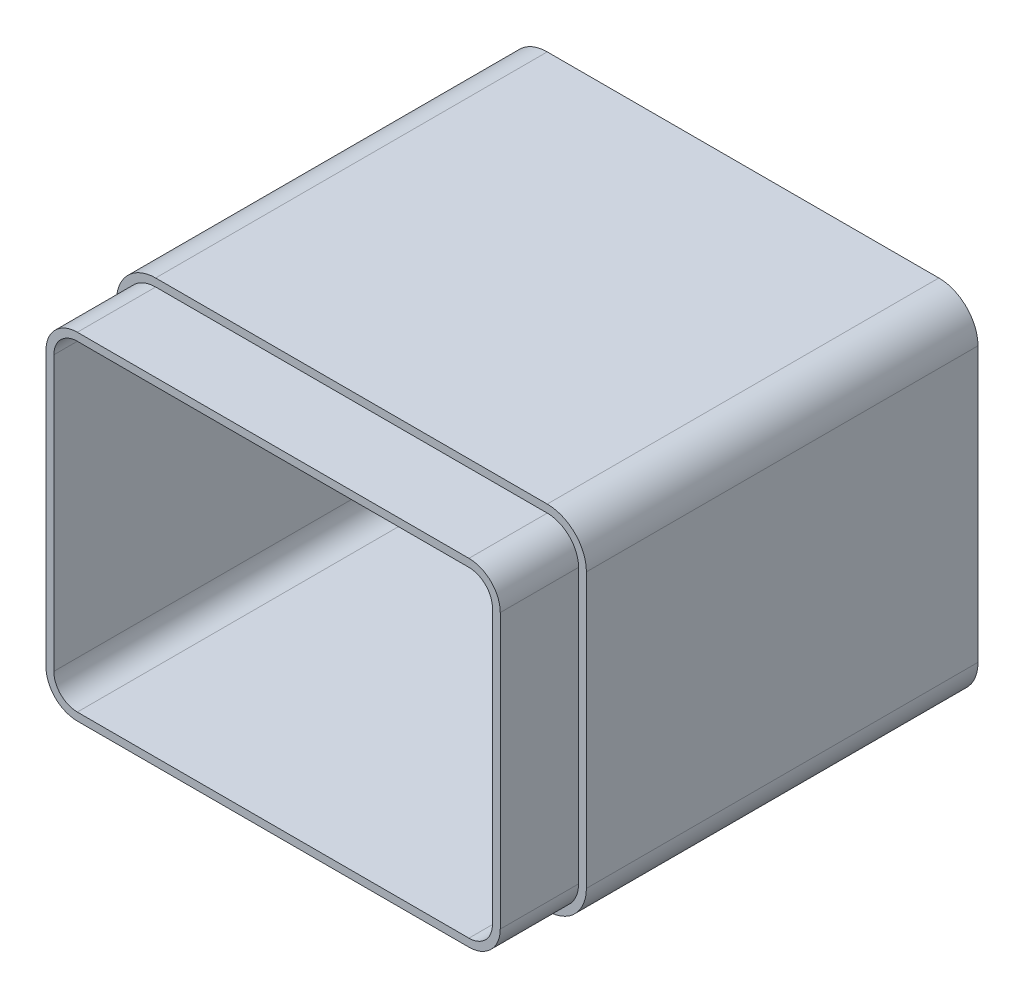
ISO-10303-21;
HEADER;
FILE_DESCRIPTION(('STEP AP214'),'2;1');
FILE_NAME('part.step','',(''),(''),'','','');
FILE_SCHEMA(('AUTOMOTIVE_DESIGN { 1 0 10303 214 1 1 1 1 }'));
ENDSEC;
DATA;
#1=APPLICATION_CONTEXT('core data for automotive mechanical design processes');
#2=APPLICATION_PROTOCOL_DEFINITION('international standard','automotive_design',2000,#1);
#3=PRODUCT_CONTEXT('',#1,'mechanical');
#4=PRODUCT('Part','Part','',(#3));
#5=PRODUCT_RELATED_PRODUCT_CATEGORY('part','',(#4));
#6=PRODUCT_DEFINITION_FORMATION('','',#4);
#7=PRODUCT_DEFINITION_CONTEXT('part definition',#1,'design');
#8=PRODUCT_DEFINITION('design','',#6,#7);
#9=PRODUCT_DEFINITION_SHAPE('','',#8);
#10=(LENGTH_UNIT() NAMED_UNIT(*) SI_UNIT(.MILLI.,.METRE.));
#11=(NAMED_UNIT(*) PLANE_ANGLE_UNIT() SI_UNIT($,.RADIAN.));
#12=(NAMED_UNIT(*) SI_UNIT($,.STERADIAN.) SOLID_ANGLE_UNIT());
#13=UNCERTAINTY_MEASURE_WITH_UNIT(LENGTH_MEASURE(1.E-05),#10,'distance_accuracy_value','');
#14=(GEOMETRIC_REPRESENTATION_CONTEXT(3) GLOBAL_UNCERTAINTY_ASSIGNED_CONTEXT((#13)) GLOBAL_UNIT_ASSIGNED_CONTEXT((#10,
#11,#12)) REPRESENTATION_CONTEXT('',''));
#15=CARTESIAN_POINT('',(0.,0.,0.));
#16=DIRECTION('',(0.,0.,1.));
#17=DIRECTION('',(1.,0.,0.));
#18=AXIS2_PLACEMENT_3D('',#15,#16,#17);
#19=CARTESIAN_POINT('',(0.,2286.,0.));
#20=DIRECTION('',(0.,0.,-1.));
#21=DIRECTION('',(-1.,0.,0.));
#22=AXIS2_PLACEMENT_3D('',#19,#20,#21);
#23=PLANE('',#22);
#24=CARTESIAN_POINT('',(2794.,2032.,0.));
#25=DIRECTION('',(0.,0.,-1.));
#26=DIRECTION('',(-1.,0.,0.));
#27=AXIS2_PLACEMENT_3D('',#24,#25,#26);
#28=CIRCLE('',#27,152.4);
#29=CARTESIAN_POINT('',(2946.4,2032.,0.));
#30=VERTEX_POINT('',#29);
#31=CARTESIAN_POINT('',(2794.,2184.4,0.));
#32=VERTEX_POINT('',#31);
#33=EDGE_CURVE('E380',#30,#32,#28,.F.);
#34=ORIENTED_EDGE('',*,*,#33,.F.);
#35=DIRECTION('',(0.,-1.,0.));
#36=VECTOR('',#35,1.);
#37=CARTESIAN_POINT('',(2946.4,2286.,0.));
#38=LINE('',#37,#36);
#39=CARTESIAN_POINT('',(2946.4,254.,0.));
#40=VERTEX_POINT('',#39);
#41=EDGE_CURVE('E346',#30,#40,#38,.T.);
#42=ORIENTED_EDGE('',*,*,#41,.T.);
#43=CARTESIAN_POINT('',(2794.,254.,0.));
#44=DIRECTION('',(0.,0.,-1.));
#45=DIRECTION('',(-1.,0.,0.));
#46=AXIS2_PLACEMENT_3D('',#43,#44,#45);
#47=CIRCLE('',#46,152.4);
#48=CARTESIAN_POINT('',(2794.,101.6,0.));
#49=VERTEX_POINT('',#48);
#50=EDGE_CURVE('E389',#49,#40,#47,.F.);
#51=ORIENTED_EDGE('',*,*,#50,.F.);
#52=DIRECTION('',(1.,0.,0.));
#53=VECTOR('',#52,1.);
#54=CARTESIAN_POINT('',(0.,101.6,0.));
#55=LINE('',#54,#53);
#56=CARTESIAN_POINT('',(254.,101.6,0.));
#57=VERTEX_POINT('',#56);
#58=EDGE_CURVE('E319',#57,#49,#55,.T.);
#59=ORIENTED_EDGE('',*,*,#58,.F.);
#60=CARTESIAN_POINT('',(254.,254.,0.));
#61=DIRECTION('',(0.,0.,-1.));
#62=DIRECTION('',(-1.,0.,0.));
#63=AXIS2_PLACEMENT_3D('',#60,#61,#62);
#64=CIRCLE('',#63,152.4);
#65=CARTESIAN_POINT('',(101.6,254.,0.));
#66=VERTEX_POINT('',#65);
#67=EDGE_CURVE('E363',#66,#57,#64,.F.);
#68=ORIENTED_EDGE('',*,*,#67,.F.);
#69=DIRECTION('',(0.,-1.,0.));
#70=VECTOR('',#69,1.);
#71=CARTESIAN_POINT('',(101.6,2286.,0.));
#72=LINE('',#71,#70);
#73=CARTESIAN_POINT('',(101.6,2032.,0.));
#74=VERTEX_POINT('',#73);
#75=EDGE_CURVE('E373',#74,#66,#72,.T.);
#76=ORIENTED_EDGE('',*,*,#75,.F.);
#77=CARTESIAN_POINT('',(254.,2032.,0.));
#78=DIRECTION('',(0.,0.,-1.));
#79=DIRECTION('',(-1.,0.,0.));
#80=AXIS2_PLACEMENT_3D('',#77,#78,#79);
#81=CIRCLE('',#80,152.4);
#82=CARTESIAN_POINT('',(254.,2184.4,0.));
#83=VERTEX_POINT('',#82);
#84=EDGE_CURVE('E386',#83,#74,#81,.F.);
#85=ORIENTED_EDGE('',*,*,#84,.F.);
#86=DIRECTION('',(1.,0.,0.));
#87=VECTOR('',#86,1.);
#88=CARTESIAN_POINT('',(0.,2184.4,0.));
#89=LINE('',#88,#87);
#90=EDGE_CURVE('E337',#83,#32,#89,.T.);
#91=ORIENTED_EDGE('',*,*,#90,.T.);
#92=EDGE_LOOP('',(#34,#42,#51,#59,#68,#76,#85,#91));
#93=FACE_BOUND('',#92,.T.);
#94=CARTESIAN_POINT('',(2794.,254.,0.));
#95=DIRECTION('',(0.,0.,1.));
#96=DIRECTION('',(1.,0.,0.));
#97=AXIS2_PLACEMENT_3D('',#94,#95,#96);
#98=CIRCLE('',#97,203.2);
#99=CARTESIAN_POINT('',(2794.,50.8,0.));
#100=VERTEX_POINT('',#99);
#101=CARTESIAN_POINT('',(2997.2,254.,0.));
#102=VERTEX_POINT('',#101);
#103=EDGE_CURVE('E255',#100,#102,#98,.T.);
#104=ORIENTED_EDGE('',*,*,#103,.T.);
#105=DIRECTION('',(0.,1.,0.));
#106=VECTOR('',#105,1.);
#107=CARTESIAN_POINT('',(2997.2,254.,0.));
#108=LINE('',#107,#106);
#109=CARTESIAN_POINT('',(2997.2,2032.,0.));
#110=VERTEX_POINT('',#109);
#111=EDGE_CURVE('E205',#102,#110,#108,.T.);
#112=ORIENTED_EDGE('',*,*,#111,.T.);
#113=CARTESIAN_POINT('',(2794.,2032.,0.));
#114=DIRECTION('',(0.,0.,1.));
#115=DIRECTION('',(1.,0.,0.));
#116=AXIS2_PLACEMENT_3D('',#113,#114,#115);
#117=CIRCLE('',#116,203.2);
#118=CARTESIAN_POINT('',(2794.,2235.2,0.));
#119=VERTEX_POINT('',#118);
#120=EDGE_CURVE('E54',#110,#119,#117,.T.);
#121=ORIENTED_EDGE('',*,*,#120,.T.);
#122=DIRECTION('',(-1.,0.,0.));
#123=VECTOR('',#122,1.);
#124=CARTESIAN_POINT('',(2794.,2235.2,0.));
#125=LINE('',#124,#123);
#126=CARTESIAN_POINT('',(254.,2235.2,0.));
#127=VERTEX_POINT('',#126);
#128=EDGE_CURVE('E262',#119,#127,#125,.T.);
#129=ORIENTED_EDGE('',*,*,#128,.T.);
#130=CARTESIAN_POINT('',(254.,2032.,0.));
#131=DIRECTION('',(0.,0.,1.));
#132=DIRECTION('',(1.,0.,0.));
#133=AXIS2_PLACEMENT_3D('',#130,#131,#132);
#134=CIRCLE('',#133,203.2);
#135=CARTESIAN_POINT('',(50.8000000000001,2032.,0.));
#136=VERTEX_POINT('',#135);
#137=EDGE_CURVE('E266',#127,#136,#134,.T.);
#138=ORIENTED_EDGE('',*,*,#137,.T.);
#139=DIRECTION('',(0.,-1.,0.));
#140=VECTOR('',#139,1.);
#141=CARTESIAN_POINT('',(50.8,2032.,0.));
#142=LINE('',#141,#140);
#143=CARTESIAN_POINT('',(50.8,254.,0.));
#144=VERTEX_POINT('',#143);
#145=EDGE_CURVE('E270',#136,#144,#142,.T.);
#146=ORIENTED_EDGE('',*,*,#145,.T.);
#147=CARTESIAN_POINT('',(254.,254.,0.));
#148=DIRECTION('',(0.,0.,1.));
#149=DIRECTION('',(1.,0.,0.));
#150=AXIS2_PLACEMENT_3D('',#147,#148,#149);
#151=CIRCLE('',#150,203.2);
#152=CARTESIAN_POINT('',(254.,50.8,0.));
#153=VERTEX_POINT('',#152);
#154=EDGE_CURVE('E232',#144,#153,#151,.T.);
#155=ORIENTED_EDGE('',*,*,#154,.T.);
#156=DIRECTION('',(1.,0.,0.));
#157=VECTOR('',#156,1.);
#158=CARTESIAN_POINT('',(254.,50.8,0.));
#159=LINE('',#158,#157);
#160=EDGE_CURVE('E228',#153,#100,#159,.T.);
#161=ORIENTED_EDGE('',*,*,#160,.T.);
#162=EDGE_LOOP('',(#104,#112,#121,#129,#138,#146,#155,#161));
#163=FACE_BOUND('',#162,.T.);
#164=ADVANCED_FACE('F38',(#93,#163),#23,.F.);
#165=CARTESIAN_POINT('',(101.6,2286.,0.));
#166=DIRECTION('',(1.,0.,0.));
#167=DIRECTION('',(0.,0.,-1.));
#168=AXIS2_PLACEMENT_3D('',#165,#166,#167);
#169=PLANE('',#168);
#170=ORIENTED_EDGE('',*,*,#75,.T.);
#171=DIRECTION('',(0.,0.,-1.));
#172=VECTOR('',#171,1.);
#173=CARTESIAN_POINT('',(101.6,254.,0.));
#174=LINE('',#173,#172);
#175=CARTESIAN_POINT('',(101.6,254.,-2946.4));
#176=VERTEX_POINT('',#175);
#177=EDGE_CURVE('E324',#176,#66,#174,.F.);
#178=ORIENTED_EDGE('',*,*,#177,.F.);
#179=DIRECTION('',(0.,-1.,0.));
#180=VECTOR('',#179,1.);
#181=CARTESIAN_POINT('',(101.6,2286.,-2946.4));
#182=LINE('',#181,#180);
#183=CARTESIAN_POINT('',(101.6,2032.,-2946.4));
#184=VERTEX_POINT('',#183);
#185=EDGE_CURVE('E325',#184,#176,#182,.T.);
#186=ORIENTED_EDGE('',*,*,#185,.F.);
#187=DIRECTION('',(0.,0.,-1.));
#188=VECTOR('',#187,1.);
#189=CARTESIAN_POINT('',(101.6,2032.,0.));
#190=LINE('',#189,#188);
#191=EDGE_CURVE('E320',#74,#184,#190,.T.);
#192=ORIENTED_EDGE('',*,*,#191,.F.);
#193=EDGE_LOOP('',(#170,#178,#186,#192));
#194=FACE_BOUND('',#193,.T.);
#195=ADVANCED_FACE('F501',(#194),#169,.T.);
#196=CARTESIAN_POINT('',(2946.4,2286.,0.));
#197=DIRECTION('',(-1.,0.,0.));
#198=DIRECTION('',(0.,0.,1.));
#199=AXIS2_PLACEMENT_3D('',#196,#197,#198);
#200=PLANE('',#199);
#201=DIRECTION('',(0.,-1.,0.));
#202=VECTOR('',#201,1.);
#203=CARTESIAN_POINT('',(2946.4,2286.,-2946.4));
#204=LINE('',#203,#202);
#205=CARTESIAN_POINT('',(2946.4,2032.,-2946.4));
#206=VERTEX_POINT('',#205);
#207=CARTESIAN_POINT('',(2946.4,254.,-2946.4));
#208=VERTEX_POINT('',#207);
#209=EDGE_CURVE('E329',#206,#208,#204,.T.);
#210=ORIENTED_EDGE('',*,*,#209,.T.);
#211=DIRECTION('',(0.,0.,1.));
#212=VECTOR('',#211,1.);
#213=CARTESIAN_POINT('',(2946.4,254.,0.));
#214=LINE('',#213,#212);
#215=EDGE_CURVE('E341',#40,#208,#214,.F.);
#216=ORIENTED_EDGE('',*,*,#215,.F.);
#217=ORIENTED_EDGE('',*,*,#41,.F.);
#218=DIRECTION('',(0.,0.,1.));
#219=VECTOR('',#218,1.);
#220=CARTESIAN_POINT('',(2946.4,2032.,0.));
#221=LINE('',#220,#219);
#222=EDGE_CURVE('E360',#206,#30,#221,.T.);
#223=ORIENTED_EDGE('',*,*,#222,.F.);
#224=EDGE_LOOP('',(#210,#216,#217,#223));
#225=FACE_BOUND('',#224,.T.);
#226=ADVANCED_FACE('F507',(#225),#200,.T.);
#227=CARTESIAN_POINT('',(0.,2286.,-2946.4));
#228=DIRECTION('',(0.,0.,1.));
#229=DIRECTION('',(1.,0.,0.));
#230=AXIS2_PLACEMENT_3D('',#227,#228,#229);
#231=PLANE('',#230);
#232=DIRECTION('',(-1.,0.,0.));
#233=VECTOR('',#232,1.);
#234=CARTESIAN_POINT('',(0.,2184.4,-2946.4));
#235=LINE('',#234,#233);
#236=CARTESIAN_POINT('',(2794.,2184.4,-2946.4));
#237=VERTEX_POINT('',#236);
#238=CARTESIAN_POINT('',(254.,2184.4,-2946.4));
#239=VERTEX_POINT('',#238);
#240=EDGE_CURVE('E330',#237,#239,#235,.T.);
#241=ORIENTED_EDGE('',*,*,#240,.T.);
#242=CARTESIAN_POINT('',(254.,2032.,-2946.4));
#243=DIRECTION('',(0.,0.,1.));
#244=DIRECTION('',(1.,0.,0.));
#245=AXIS2_PLACEMENT_3D('',#242,#243,#244);
#246=CIRCLE('',#245,152.4);
#247=EDGE_CURVE('E349',#184,#239,#246,.F.);
#248=ORIENTED_EDGE('',*,*,#247,.F.);
#249=ORIENTED_EDGE('',*,*,#185,.T.);
#250=CARTESIAN_POINT('',(254.,254.,-2946.4));
#251=DIRECTION('',(0.,0.,1.));
#252=DIRECTION('',(1.,0.,0.));
#253=AXIS2_PLACEMENT_3D('',#250,#251,#252);
#254=CIRCLE('',#253,152.4);
#255=CARTESIAN_POINT('',(254.,101.6,-2946.4));
#256=VERTEX_POINT('',#255);
#257=EDGE_CURVE('E354',#256,#176,#254,.F.);
#258=ORIENTED_EDGE('',*,*,#257,.F.);
#259=DIRECTION('',(-1.,0.,0.));
#260=VECTOR('',#259,1.);
#261=CARTESIAN_POINT('',(0.,101.6,-2946.4));
#262=LINE('',#261,#260);
#263=CARTESIAN_POINT('',(2794.,101.6,-2946.4));
#264=VERTEX_POINT('',#263);
#265=EDGE_CURVE('E350',#264,#256,#262,.T.);
#266=ORIENTED_EDGE('',*,*,#265,.F.);
#267=CARTESIAN_POINT('',(2794.,254.,-2946.4));
#268=DIRECTION('',(0.,0.,1.));
#269=DIRECTION('',(1.,0.,0.));
#270=AXIS2_PLACEMENT_3D('',#267,#268,#269);
#271=CIRCLE('',#270,152.4);
#272=EDGE_CURVE('E342',#208,#264,#271,.F.);
#273=ORIENTED_EDGE('',*,*,#272,.F.);
#274=ORIENTED_EDGE('',*,*,#209,.F.);
#275=CARTESIAN_POINT('',(2794.,2032.,-2946.4));
#276=DIRECTION('',(0.,0.,1.));
#277=DIRECTION('',(1.,0.,0.));
#278=AXIS2_PLACEMENT_3D('',#275,#276,#277);
#279=CIRCLE('',#278,152.4);
#280=EDGE_CURVE('E338',#237,#206,#279,.F.);
#281=ORIENTED_EDGE('',*,*,#280,.F.);
#282=EDGE_LOOP('',(#241,#248,#249,#258,#266,#273,#274,#281));
#283=FACE_BOUND('',#282,.T.);
#284=ADVANCED_FACE('F552',(#283),#231,.T.);
#285=CARTESIAN_POINT('',(0.,2184.4,0.));
#286=DIRECTION('',(0.,-1.,0.));
#287=DIRECTION('',(0.,0.,-1.));
#288=AXIS2_PLACEMENT_3D('',#285,#286,#287);
#289=PLANE('',#288);
#290=ORIENTED_EDGE('',*,*,#90,.F.);
#291=DIRECTION('',(0.,0.,-1.));
#292=VECTOR('',#291,1.);
#293=CARTESIAN_POINT('',(254.,2184.4,0.));
#294=LINE('',#293,#292);
#295=EDGE_CURVE('E370',#239,#83,#294,.F.);
#296=ORIENTED_EDGE('',*,*,#295,.F.);
#297=ORIENTED_EDGE('',*,*,#240,.F.);
#298=DIRECTION('',(0.,0.,-1.));
#299=VECTOR('',#298,1.);
#300=CARTESIAN_POINT('',(2794.,2184.4,0.));
#301=LINE('',#300,#299);
#302=EDGE_CURVE('E357',#32,#237,#301,.T.);
#303=ORIENTED_EDGE('',*,*,#302,.F.);
#304=EDGE_LOOP('',(#290,#296,#297,#303));
#305=FACE_BOUND('',#304,.T.);
#306=ADVANCED_FACE('F548',(#305),#289,.T.);
#307=CARTESIAN_POINT('',(0.,101.6,0.));
#308=DIRECTION('',(0.,-1.,0.));
#309=DIRECTION('',(0.,0.,-1.));
#310=AXIS2_PLACEMENT_3D('',#307,#308,#309);
#311=PLANE('',#310);
#312=ORIENTED_EDGE('',*,*,#265,.T.);
#313=DIRECTION('',(0.,0.,-1.));
#314=VECTOR('',#313,1.);
#315=CARTESIAN_POINT('',(254.,101.6,0.));
#316=LINE('',#315,#314);
#317=EDGE_CURVE('E377',#57,#256,#316,.T.);
#318=ORIENTED_EDGE('',*,*,#317,.F.);
#319=ORIENTED_EDGE('',*,*,#58,.T.);
#320=DIRECTION('',(0.,0.,-1.));
#321=VECTOR('',#320,1.);
#322=CARTESIAN_POINT('',(2794.,101.6,0.));
#323=LINE('',#322,#321);
#324=EDGE_CURVE('E333',#264,#49,#323,.F.);
#325=ORIENTED_EDGE('',*,*,#324,.F.);
#326=EDGE_LOOP('',(#312,#318,#319,#325));
#327=FACE_BOUND('',#326,.T.);
#328=ADVANCED_FACE('F544',(#327),#311,.F.);
#329=CARTESIAN_POINT('',(2794.,2032.,0.));
#330=DIRECTION('',(0.,0.,-1.));
#331=DIRECTION('',(-1.,0.,0.));
#332=AXIS2_PLACEMENT_3D('',#329,#330,#331);
#333=CYLINDRICAL_SURFACE('',#332,152.4);
#334=ORIENTED_EDGE('',*,*,#33,.T.);
#335=ORIENTED_EDGE('',*,*,#302,.T.);
#336=ORIENTED_EDGE('',*,*,#280,.T.);
#337=ORIENTED_EDGE('',*,*,#222,.T.);
#338=EDGE_LOOP('',(#334,#335,#336,#337));
#339=FACE_BOUND('',#338,.T.);
#340=ADVANCED_FACE('F540',(#339),#333,.F.);
#341=CARTESIAN_POINT('',(2794.,254.,0.));
#342=DIRECTION('',(0.,0.,1.));
#343=DIRECTION('',(1.,0.,0.));
#344=AXIS2_PLACEMENT_3D('',#341,#342,#343);
#345=CYLINDRICAL_SURFACE('',#344,152.4);
#346=ORIENTED_EDGE('',*,*,#50,.T.);
#347=ORIENTED_EDGE('',*,*,#215,.T.);
#348=ORIENTED_EDGE('',*,*,#272,.T.);
#349=ORIENTED_EDGE('',*,*,#324,.T.);
#350=EDGE_LOOP('',(#346,#347,#348,#349));
#351=FACE_BOUND('',#350,.T.);
#352=ADVANCED_FACE('F536',(#351),#345,.F.);
#353=CARTESIAN_POINT('',(254.,2032.,0.));
#354=DIRECTION('',(0.,0.,1.));
#355=DIRECTION('',(1.,0.,0.));
#356=AXIS2_PLACEMENT_3D('',#353,#354,#355);
#357=CYLINDRICAL_SURFACE('',#356,152.4);
#358=ORIENTED_EDGE('',*,*,#247,.T.);
#359=ORIENTED_EDGE('',*,*,#295,.T.);
#360=ORIENTED_EDGE('',*,*,#84,.T.);
#361=ORIENTED_EDGE('',*,*,#191,.T.);
#362=EDGE_LOOP('',(#358,#359,#360,#361));
#363=FACE_BOUND('',#362,.T.);
#364=ADVANCED_FACE('F532',(#363),#357,.F.);
#365=CARTESIAN_POINT('',(254.,254.,0.));
#366=DIRECTION('',(0.,0.,-1.));
#367=DIRECTION('',(-1.,0.,0.));
#368=AXIS2_PLACEMENT_3D('',#365,#366,#367);
#369=CYLINDRICAL_SURFACE('',#368,152.4);
#370=ORIENTED_EDGE('',*,*,#257,.T.);
#371=ORIENTED_EDGE('',*,*,#177,.T.);
#372=ORIENTED_EDGE('',*,*,#67,.T.);
#373=ORIENTED_EDGE('',*,*,#317,.T.);
#374=EDGE_LOOP('',(#370,#371,#372,#373));
#375=FACE_BOUND('',#374,.T.);
#376=ADVANCED_FACE('F529',(#375),#369,.F.);
#377=CARTESIAN_POINT('',(2794.,254.,-508.));
#378=DIRECTION('',(0.,0.,1.));
#379=DIRECTION('',(1.,0.,0.));
#380=AXIS2_PLACEMENT_3D('',#377,#378,#379);
#381=PLANE('',#380);
#382=DIRECTION('',(1.,0.,0.));
#383=VECTOR('',#382,1.);
#384=CARTESIAN_POINT('',(254.,50.8,-508.));
#385=LINE('',#384,#383);
#386=CARTESIAN_POINT('',(254.,50.8,-508.));
#387=VERTEX_POINT('',#386);
#388=CARTESIAN_POINT('',(2794.,50.8,-508.));
#389=VERTEX_POINT('',#388);
#390=EDGE_CURVE('E212',#387,#389,#385,.T.);
#391=ORIENTED_EDGE('',*,*,#390,.F.);
#392=CARTESIAN_POINT('',(254.,254.,-508.));
#393=DIRECTION('',(0.,0.,1.));
#394=DIRECTION('',(1.,0.,0.));
#395=AXIS2_PLACEMENT_3D('',#392,#393,#394);
#396=CIRCLE('',#395,203.2);
#397=CARTESIAN_POINT('',(50.8,254.,-508.));
#398=VERTEX_POINT('',#397);
#399=EDGE_CURVE('E249',#398,#387,#396,.T.);
#400=ORIENTED_EDGE('',*,*,#399,.F.);
#401=DIRECTION('',(0.,-1.,0.));
#402=VECTOR('',#401,1.);
#403=CARTESIAN_POINT('',(50.8,2032.,-508.));
#404=LINE('',#403,#402);
#405=CARTESIAN_POINT('',(50.8000000000001,2032.,-508.));
#406=VERTEX_POINT('',#405);
#407=EDGE_CURVE('E245',#406,#398,#404,.T.);
#408=ORIENTED_EDGE('',*,*,#407,.F.);
#409=CARTESIAN_POINT('',(254.,2032.,-508.));
#410=DIRECTION('',(0.,0.,1.));
#411=DIRECTION('',(1.,0.,0.));
#412=AXIS2_PLACEMENT_3D('',#409,#410,#411);
#413=CIRCLE('',#412,203.2);
#414=CARTESIAN_POINT('',(254.,2235.2,-508.));
#415=VERTEX_POINT('',#414);
#416=EDGE_CURVE('E241',#415,#406,#413,.T.);
#417=ORIENTED_EDGE('',*,*,#416,.F.);
#418=DIRECTION('',(-1.,0.,0.));
#419=VECTOR('',#418,1.);
#420=CARTESIAN_POINT('',(2794.,2235.2,-508.));
#421=LINE('',#420,#419);
#422=CARTESIAN_POINT('',(2794.,2235.2,-508.));
#423=VERTEX_POINT('',#422);
#424=EDGE_CURVE('E237',#423,#415,#421,.T.);
#425=ORIENTED_EDGE('',*,*,#424,.F.);
#426=CARTESIAN_POINT('',(2794.,2032.,-508.));
#427=DIRECTION('',(0.,0.,1.));
#428=DIRECTION('',(1.,0.,0.));
#429=AXIS2_PLACEMENT_3D('',#426,#427,#428);
#430=CIRCLE('',#429,203.2);
#431=CARTESIAN_POINT('',(2997.2,2032.,-508.));
#432=VERTEX_POINT('',#431);
#433=EDGE_CURVE('E222',#432,#423,#430,.T.);
#434=ORIENTED_EDGE('',*,*,#433,.F.);
#435=DIRECTION('',(0.,1.,0.));
#436=VECTOR('',#435,1.);
#437=CARTESIAN_POINT('',(2997.2,254.,-508.));
#438=LINE('',#437,#436);
#439=CARTESIAN_POINT('',(2997.2,254.,-508.));
#440=VERTEX_POINT('',#439);
#441=EDGE_CURVE('E203',#440,#432,#438,.T.);
#442=ORIENTED_EDGE('',*,*,#441,.F.);
#443=CARTESIAN_POINT('',(2794.,254.,-508.));
#444=DIRECTION('',(0.,0.,1.));
#445=DIRECTION('',(1.,0.,0.));
#446=AXIS2_PLACEMENT_3D('',#443,#444,#445);
#447=CIRCLE('',#446,203.2);
#448=EDGE_CURVE('E218',#389,#440,#447,.T.);
#449=ORIENTED_EDGE('',*,*,#448,.F.);
#450=EDGE_LOOP('',(#391,#400,#408,#417,#425,#434,#442,#449));
#451=FACE_BOUND('',#450,.T.);
#452=CARTESIAN_POINT('',(2794.,254.,-508.));
#453=DIRECTION('',(0.,0.,1.));
#454=DIRECTION('',(1.,0.,0.));
#455=AXIS2_PLACEMENT_3D('',#452,#453,#454);
#456=CIRCLE('',#455,254.);
#457=CARTESIAN_POINT('',(2794.,0.,-508.));
#458=VERTEX_POINT('',#457);
#459=CARTESIAN_POINT('',(3048.,254.,-508.));
#460=VERTEX_POINT('',#459);
#461=EDGE_CURVE('E279',#458,#460,#456,.T.);
#462=ORIENTED_EDGE('',*,*,#461,.T.);
#463=DIRECTION('',(0.,1.,0.));
#464=VECTOR('',#463,1.);
#465=CARTESIAN_POINT('',(3048.,254.,-508.));
#466=LINE('',#465,#464);
#467=CARTESIAN_POINT('',(3048.,2032.,-508.));
#468=VERTEX_POINT('',#467);
#469=EDGE_CURVE('E299',#460,#468,#466,.T.);
#470=ORIENTED_EDGE('',*,*,#469,.T.);
#471=CARTESIAN_POINT('',(2794.,2032.,-508.));
#472=DIRECTION('',(0.,0.,1.));
#473=DIRECTION('',(1.,0.,0.));
#474=AXIS2_PLACEMENT_3D('',#471,#472,#473);
#475=CIRCLE('',#474,254.);
#476=CARTESIAN_POINT('',(2794.,2286.,-508.));
#477=VERTEX_POINT('',#476);
#478=EDGE_CURVE('E302',#468,#477,#475,.T.);
#479=ORIENTED_EDGE('',*,*,#478,.T.);
#480=DIRECTION('',(-1.,0.,0.));
#481=VECTOR('',#480,1.);
#482=CARTESIAN_POINT('',(2794.,2286.,-508.));
#483=LINE('',#482,#481);
#484=CARTESIAN_POINT('',(254.,2286.,-508.));
#485=VERTEX_POINT('',#484);
#486=EDGE_CURVE('E305',#477,#485,#483,.T.);
#487=ORIENTED_EDGE('',*,*,#486,.T.);
#488=CARTESIAN_POINT('',(254.,2032.,-508.));
#489=DIRECTION('',(0.,0.,1.));
#490=DIRECTION('',(1.,0.,0.));
#491=AXIS2_PLACEMENT_3D('',#488,#489,#490);
#492=CIRCLE('',#491,254.);
#493=CARTESIAN_POINT('',(0.,2032.,-508.));
#494=VERTEX_POINT('',#493);
#495=EDGE_CURVE('E308',#485,#494,#492,.T.);
#496=ORIENTED_EDGE('',*,*,#495,.T.);
#497=DIRECTION('',(0.,-1.,0.));
#498=VECTOR('',#497,1.);
#499=CARTESIAN_POINT('',(0.,2032.,-508.));
#500=LINE('',#499,#498);
#501=CARTESIAN_POINT('',(0.,254.,-508.));
#502=VERTEX_POINT('',#501);
#503=EDGE_CURVE('E62',#494,#502,#500,.T.);
#504=ORIENTED_EDGE('',*,*,#503,.T.);
#505=CARTESIAN_POINT('',(254.,254.,-508.));
#506=DIRECTION('',(0.,0.,1.));
#507=DIRECTION('',(1.,0.,0.));
#508=AXIS2_PLACEMENT_3D('',#505,#506,#507);
#509=CIRCLE('',#508,254.);
#510=CARTESIAN_POINT('',(254.,0.,-508.));
#511=VERTEX_POINT('',#510);
#512=EDGE_CURVE('E313',#502,#511,#509,.T.);
#513=ORIENTED_EDGE('',*,*,#512,.T.);
#514=DIRECTION('',(1.,0.,0.));
#515=VECTOR('',#514,1.);
#516=CARTESIAN_POINT('',(254.,0.,-508.));
#517=LINE('',#516,#515);
#518=EDGE_CURVE('E316',#511,#458,#517,.T.);
#519=ORIENTED_EDGE('',*,*,#518,.T.);
#520=EDGE_LOOP('',(#462,#470,#479,#487,#496,#504,#513,#519));
#521=FACE_BOUND('',#520,.T.);
#522=ADVANCED_FACE('F217',(#451,#521),#381,.T.);
#523=CARTESIAN_POINT('',(2794.,254.,-508.));
#524=DIRECTION('',(0.,0.,1.));
#525=DIRECTION('',(1.,0.,0.));
#526=AXIS2_PLACEMENT_3D('',#523,#524,#525);
#527=CYLINDRICAL_SURFACE('',#526,203.2);
#528=ORIENTED_EDGE('',*,*,#103,.F.);
#529=DIRECTION('',(0.,0.,1.));
#530=VECTOR('',#529,1.);
#531=CARTESIAN_POINT('',(2794.,50.8,-508.));
#532=LINE('',#531,#530);
#533=EDGE_CURVE('E226',#389,#100,#532,.T.);
#534=ORIENTED_EDGE('',*,*,#533,.F.);
#535=ORIENTED_EDGE('',*,*,#448,.T.);
#536=DIRECTION('',(0.,0.,1.));
#537=VECTOR('',#536,1.);
#538=CARTESIAN_POINT('',(2997.2,254.,-508.));
#539=LINE('',#538,#537);
#540=EDGE_CURVE('E200',#440,#102,#539,.T.);
#541=ORIENTED_EDGE('',*,*,#540,.T.);
#542=EDGE_LOOP('',(#528,#534,#535,#541));
#543=FACE_BOUND('',#542,.T.);
#544=ADVANCED_FACE('F225',(#543),#527,.T.);
#545=CARTESIAN_POINT('',(254.,50.8,-508.));
#546=DIRECTION('',(0.,-1.,0.));
#547=DIRECTION('',(1.,0.,0.));
#548=AXIS2_PLACEMENT_3D('',#545,#546,#547);
#549=PLANE('',#548);
#550=ORIENTED_EDGE('',*,*,#160,.F.);
#551=DIRECTION('',(0.,0.,1.));
#552=VECTOR('',#551,1.);
#553=CARTESIAN_POINT('',(254.,50.8,-508.));
#554=LINE('',#553,#552);
#555=EDGE_CURVE('E280',#387,#153,#554,.T.);
#556=ORIENTED_EDGE('',*,*,#555,.F.);
#557=ORIENTED_EDGE('',*,*,#390,.T.);
#558=ORIENTED_EDGE('',*,*,#533,.T.);
#559=EDGE_LOOP('',(#550,#556,#557,#558));
#560=FACE_BOUND('',#559,.T.);
#561=ADVANCED_FACE('F563',(#560),#549,.T.);
#562=CARTESIAN_POINT('',(254.,254.,-508.));
#563=DIRECTION('',(0.,0.,1.));
#564=DIRECTION('',(1.,0.,0.));
#565=AXIS2_PLACEMENT_3D('',#562,#563,#564);
#566=CYLINDRICAL_SURFACE('',#565,203.2);
#567=ORIENTED_EDGE('',*,*,#154,.F.);
#568=DIRECTION('',(0.,0.,1.));
#569=VECTOR('',#568,1.);
#570=CARTESIAN_POINT('',(50.8,254.,-508.));
#571=LINE('',#570,#569);
#572=EDGE_CURVE('E283',#398,#144,#571,.T.);
#573=ORIENTED_EDGE('',*,*,#572,.F.);
#574=ORIENTED_EDGE('',*,*,#399,.T.);
#575=ORIENTED_EDGE('',*,*,#555,.T.);
#576=EDGE_LOOP('',(#567,#573,#574,#575));
#577=FACE_BOUND('',#576,.T.);
#578=ADVANCED_FACE('F578',(#577),#566,.T.);
#579=CARTESIAN_POINT('',(50.8,2032.,-508.));
#580=DIRECTION('',(-1.,0.,0.));
#581=DIRECTION('',(0.,-1.,0.));
#582=AXIS2_PLACEMENT_3D('',#579,#580,#581);
#583=PLANE('',#582);
#584=ORIENTED_EDGE('',*,*,#145,.F.);
#585=DIRECTION('',(0.,0.,1.));
#586=VECTOR('',#585,1.);
#587=CARTESIAN_POINT('',(50.8000000000001,2032.,-508.));
#588=LINE('',#587,#586);
#589=EDGE_CURVE('E286',#406,#136,#588,.T.);
#590=ORIENTED_EDGE('',*,*,#589,.F.);
#591=ORIENTED_EDGE('',*,*,#407,.T.);
#592=ORIENTED_EDGE('',*,*,#572,.T.);
#593=EDGE_LOOP('',(#584,#590,#591,#592));
#594=FACE_BOUND('',#593,.T.);
#595=ADVANCED_FACE('F574',(#594),#583,.T.);
#596=CARTESIAN_POINT('',(254.,2032.,-508.));
#597=DIRECTION('',(0.,0.,1.));
#598=DIRECTION('',(1.,0.,0.));
#599=AXIS2_PLACEMENT_3D('',#596,#597,#598);
#600=CYLINDRICAL_SURFACE('',#599,203.2);
#601=ORIENTED_EDGE('',*,*,#137,.F.);
#602=DIRECTION('',(0.,0.,1.));
#603=VECTOR('',#602,1.);
#604=CARTESIAN_POINT('',(254.,2235.2,-508.));
#605=LINE('',#604,#603);
#606=EDGE_CURVE('E289',#415,#127,#605,.T.);
#607=ORIENTED_EDGE('',*,*,#606,.F.);
#608=ORIENTED_EDGE('',*,*,#416,.T.);
#609=ORIENTED_EDGE('',*,*,#589,.T.);
#610=EDGE_LOOP('',(#601,#607,#608,#609));
#611=FACE_BOUND('',#610,.T.);
#612=ADVANCED_FACE('F570',(#611),#600,.T.);
#613=CARTESIAN_POINT('',(2794.,2235.2,-508.));
#614=DIRECTION('',(0.,1.,0.));
#615=DIRECTION('',(0.,0.,1.));
#616=AXIS2_PLACEMENT_3D('',#613,#614,#615);
#617=PLANE('',#616);
#618=ORIENTED_EDGE('',*,*,#128,.F.);
#619=DIRECTION('',(0.,0.,1.));
#620=VECTOR('',#619,1.);
#621=CARTESIAN_POINT('',(2794.,2235.2,-508.));
#622=LINE('',#621,#620);
#623=EDGE_CURVE('E292',#423,#119,#622,.T.);
#624=ORIENTED_EDGE('',*,*,#623,.F.);
#625=ORIENTED_EDGE('',*,*,#424,.T.);
#626=ORIENTED_EDGE('',*,*,#606,.T.);
#627=EDGE_LOOP('',(#618,#624,#625,#626));
#628=FACE_BOUND('',#627,.T.);
#629=ADVANCED_FACE('F567',(#628),#617,.T.);
#630=CARTESIAN_POINT('',(2794.,2032.,-508.));
#631=DIRECTION('',(0.,0.,1.));
#632=DIRECTION('',(1.,0.,0.));
#633=AXIS2_PLACEMENT_3D('',#630,#631,#632);
#634=CYLINDRICAL_SURFACE('',#633,203.2);
#635=ORIENTED_EDGE('',*,*,#120,.F.);
#636=DIRECTION('',(0.,0.,1.));
#637=VECTOR('',#636,1.);
#638=CARTESIAN_POINT('',(2997.2,2032.,-508.));
#639=LINE('',#638,#637);
#640=EDGE_CURVE('E211',#432,#110,#639,.T.);
#641=ORIENTED_EDGE('',*,*,#640,.F.);
#642=ORIENTED_EDGE('',*,*,#433,.T.);
#643=ORIENTED_EDGE('',*,*,#623,.T.);
#644=EDGE_LOOP('',(#635,#641,#642,#643));
#645=FACE_BOUND('',#644,.T.);
#646=ADVANCED_FACE('F496',(#645),#634,.T.);
#647=CARTESIAN_POINT('',(2997.2,254.,-508.));
#648=DIRECTION('',(1.,0.,0.));
#649=DIRECTION('',(0.,0.,-1.));
#650=AXIS2_PLACEMENT_3D('',#647,#648,#649);
#651=PLANE('',#650);
#652=ORIENTED_EDGE('',*,*,#111,.F.);
#653=ORIENTED_EDGE('',*,*,#540,.F.);
#654=ORIENTED_EDGE('',*,*,#441,.T.);
#655=ORIENTED_EDGE('',*,*,#640,.T.);
#656=EDGE_LOOP('',(#652,#653,#654,#655));
#657=FACE_BOUND('',#656,.T.);
#658=ADVANCED_FACE('F202',(#657),#651,.T.);
#659=CARTESIAN_POINT('',(0.,2286.,-3048.));
#660=DIRECTION('',(0.,0.,1.));
#661=DIRECTION('',(1.,0.,0.));
#662=AXIS2_PLACEMENT_3D('',#659,#660,#661);
#663=PLANE('',#662);
#664=DIRECTION('',(-1.,0.,0.));
#665=VECTOR('',#664,1.);
#666=CARTESIAN_POINT('',(0.,2286.,-3048.));
#667=LINE('',#666,#665);
#668=CARTESIAN_POINT('',(2794.,2286.,-3048.));
#669=VERTEX_POINT('',#668);
#670=CARTESIAN_POINT('',(254.,2286.,-3048.));
#671=VERTEX_POINT('',#670);
#672=EDGE_CURVE('E402',#669,#671,#667,.T.);
#673=ORIENTED_EDGE('',*,*,#672,.F.);
#674=CARTESIAN_POINT('',(2794.,2032.,-3048.));
#675=DIRECTION('',(0.,0.,1.));
#676=DIRECTION('',(1.,0.,0.));
#677=AXIS2_PLACEMENT_3D('',#674,#675,#676);
#678=CIRCLE('',#677,254.);
#679=CARTESIAN_POINT('',(3048.,2032.,-3048.));
#680=VERTEX_POINT('',#679);
#681=EDGE_CURVE('E433',#669,#680,#678,.F.);
#682=ORIENTED_EDGE('',*,*,#681,.T.);
#683=DIRECTION('',(0.,-1.,0.));
#684=VECTOR('',#683,1.);
#685=CARTESIAN_POINT('',(3048.,2286.,-3048.));
#686=LINE('',#685,#684);
#687=CARTESIAN_POINT('',(3048.,254.,-3048.));
#688=VERTEX_POINT('',#687);
#689=EDGE_CURVE('E413',#680,#688,#686,.T.);
#690=ORIENTED_EDGE('',*,*,#689,.T.);
#691=CARTESIAN_POINT('',(2794.,254.,-3048.));
#692=DIRECTION('',(0.,0.,1.));
#693=DIRECTION('',(1.,0.,0.));
#694=AXIS2_PLACEMENT_3D('',#691,#692,#693);
#695=CIRCLE('',#694,254.);
#696=CARTESIAN_POINT('',(2794.,0.,-3048.));
#697=VERTEX_POINT('',#696);
#698=EDGE_CURVE('E430',#688,#697,#695,.F.);
#699=ORIENTED_EDGE('',*,*,#698,.T.);
#700=DIRECTION('',(-1.,0.,0.));
#701=VECTOR('',#700,1.);
#702=CARTESIAN_POINT('',(0.,0.,-3048.));
#703=LINE('',#702,#701);
#704=CARTESIAN_POINT('',(254.,0.,-3048.));
#705=VERTEX_POINT('',#704);
#706=EDGE_CURVE('E323',#697,#705,#703,.T.);
#707=ORIENTED_EDGE('',*,*,#706,.T.);
#708=CARTESIAN_POINT('',(254.,254.,-3048.));
#709=DIRECTION('',(0.,0.,1.));
#710=DIRECTION('',(1.,0.,0.));
#711=AXIS2_PLACEMENT_3D('',#708,#709,#710);
#712=CIRCLE('',#711,254.);
#713=CARTESIAN_POINT('',(0.,254.,-3048.));
#714=VERTEX_POINT('',#713);
#715=EDGE_CURVE('E424',#705,#714,#712,.F.);
#716=ORIENTED_EDGE('',*,*,#715,.T.);
#717=DIRECTION('',(0.,-1.,0.));
#718=VECTOR('',#717,1.);
#719=CARTESIAN_POINT('',(0.,2286.,-3048.));
#720=LINE('',#719,#718);
#721=CARTESIAN_POINT('',(0.,2032.,-3048.));
#722=VERTEX_POINT('',#721);
#723=EDGE_CURVE('E406',#722,#714,#720,.T.);
#724=ORIENTED_EDGE('',*,*,#723,.F.);
#725=CARTESIAN_POINT('',(254.,2032.,-3048.));
#726=DIRECTION('',(0.,0.,1.));
#727=DIRECTION('',(1.,0.,0.));
#728=AXIS2_PLACEMENT_3D('',#725,#726,#727);
#729=CIRCLE('',#728,254.);
#730=EDGE_CURVE('E427',#722,#671,#729,.F.);
#731=ORIENTED_EDGE('',*,*,#730,.T.);
#732=EDGE_LOOP('',(#673,#682,#690,#699,#707,#716,#724,#731));
#733=FACE_BOUND('',#732,.T.);
#734=ADVANCED_FACE('F489',(#733),#663,.F.);
#735=CARTESIAN_POINT('',(254.,2032.,0.));
#736=DIRECTION('',(0.,0.,1.));
#737=DIRECTION('',(1.,0.,0.));
#738=AXIS2_PLACEMENT_3D('',#735,#736,#737);
#739=CYLINDRICAL_SURFACE('',#738,254.);
#740=DIRECTION('',(0.,0.,1.));
#741=VECTOR('',#740,1.);
#742=CARTESIAN_POINT('',(0.,2032.,0.));
#743=LINE('',#742,#741);
#744=EDGE_CURVE('E11',#494,#722,#743,.F.);
#745=ORIENTED_EDGE('',*,*,#744,.F.);
#746=ORIENTED_EDGE('',*,*,#495,.F.);
#747=DIRECTION('',(0.,0.,1.));
#748=VECTOR('',#747,1.);
#749=CARTESIAN_POINT('',(254.,2286.,0.));
#750=LINE('',#749,#748);
#751=EDGE_CURVE('E417',#671,#485,#750,.T.);
#752=ORIENTED_EDGE('',*,*,#751,.F.);
#753=ORIENTED_EDGE('',*,*,#730,.F.);
#754=EDGE_LOOP('',(#745,#746,#752,#753));
#755=FACE_BOUND('',#754,.T.);
#756=ADVANCED_FACE('F487',(#755),#739,.T.);
#757=CARTESIAN_POINT('',(2794.,2032.,0.));
#758=DIRECTION('',(0.,0.,-1.));
#759=DIRECTION('',(-1.,0.,0.));
#760=AXIS2_PLACEMENT_3D('',#757,#758,#759);
#761=CYLINDRICAL_SURFACE('',#760,254.);
#762=DIRECTION('',(0.,0.,-1.));
#763=VECTOR('',#762,1.);
#764=CARTESIAN_POINT('',(2794.,2286.,0.));
#765=LINE('',#764,#763);
#766=EDGE_CURVE('E421',#477,#669,#765,.T.);
#767=ORIENTED_EDGE('',*,*,#766,.F.);
#768=ORIENTED_EDGE('',*,*,#478,.F.);
#769=DIRECTION('',(0.,0.,-1.));
#770=VECTOR('',#769,1.);
#771=CARTESIAN_POINT('',(3048.,2032.,0.));
#772=LINE('',#771,#770);
#773=EDGE_CURVE('E439',#680,#468,#772,.F.);
#774=ORIENTED_EDGE('',*,*,#773,.F.);
#775=ORIENTED_EDGE('',*,*,#681,.F.);
#776=EDGE_LOOP('',(#767,#768,#774,#775));
#777=FACE_BOUND('',#776,.T.);
#778=ADVANCED_FACE('F478',(#777),#761,.T.);
#779=CARTESIAN_POINT('',(0.,2286.,0.));
#780=DIRECTION('',(0.,-1.,0.));
#781=DIRECTION('',(0.,0.,-1.));
#782=AXIS2_PLACEMENT_3D('',#779,#780,#781);
#783=PLANE('',#782);
#784=ORIENTED_EDGE('',*,*,#486,.F.);
#785=ORIENTED_EDGE('',*,*,#766,.T.);
#786=ORIENTED_EDGE('',*,*,#672,.T.);
#787=ORIENTED_EDGE('',*,*,#751,.T.);
#788=EDGE_LOOP('',(#784,#785,#786,#787));
#789=FACE_BOUND('',#788,.T.);
#790=ADVANCED_FACE('F483',(#789),#783,.F.);
#791=CARTESIAN_POINT('',(254.,254.,0.));
#792=DIRECTION('',(0.,0.,-1.));
#793=DIRECTION('',(-1.,0.,0.));
#794=AXIS2_PLACEMENT_3D('',#791,#792,#793);
#795=CYLINDRICAL_SURFACE('',#794,254.);
#796=DIRECTION('',(0.,0.,1.));
#797=VECTOR('',#796,1.);
#798=CARTESIAN_POINT('',(254.,0.,-3048.));
#799=LINE('',#798,#797);
#800=EDGE_CURVE('E443',#511,#705,#799,.F.);
#801=ORIENTED_EDGE('',*,*,#800,.F.);
#802=ORIENTED_EDGE('',*,*,#512,.F.);
#803=DIRECTION('',(0.,0.,1.));
#804=VECTOR('',#803,1.);
#805=CARTESIAN_POINT('',(0.,254.,0.));
#806=LINE('',#805,#804);
#807=EDGE_CURVE('E47',#714,#502,#806,.T.);
#808=ORIENTED_EDGE('',*,*,#807,.F.);
#809=ORIENTED_EDGE('',*,*,#715,.F.);
#810=EDGE_LOOP('',(#801,#802,#808,#809));
#811=FACE_BOUND('',#810,.T.);
#812=ADVANCED_FACE('F40',(#811),#795,.T.);
#813=CARTESIAN_POINT('',(2794.,254.,0.));
#814=DIRECTION('',(0.,0.,1.));
#815=DIRECTION('',(1.,0.,0.));
#816=AXIS2_PLACEMENT_3D('',#813,#814,#815);
#817=CYLINDRICAL_SURFACE('',#816,254.);
#818=DIRECTION('',(0.,0.,-1.));
#819=VECTOR('',#818,1.);
#820=CARTESIAN_POINT('',(3048.,254.,-3048.));
#821=LINE('',#820,#819);
#822=EDGE_CURVE('E436',#460,#688,#821,.T.);
#823=ORIENTED_EDGE('',*,*,#822,.F.);
#824=ORIENTED_EDGE('',*,*,#461,.F.);
#825=DIRECTION('',(0.,0.,-1.));
#826=VECTOR('',#825,1.);
#827=CARTESIAN_POINT('',(2794.,0.,0.));
#828=LINE('',#827,#826);
#829=EDGE_CURVE('E446',#697,#458,#828,.F.);
#830=ORIENTED_EDGE('',*,*,#829,.F.);
#831=ORIENTED_EDGE('',*,*,#698,.F.);
#832=EDGE_LOOP('',(#823,#824,#830,#831));
#833=FACE_BOUND('',#832,.T.);
#834=ADVANCED_FACE('F468',(#833),#817,.T.);
#835=CARTESIAN_POINT('',(0.,0.,0.));
#836=DIRECTION('',(0.,-1.,0.));
#837=DIRECTION('',(0.,0.,-1.));
#838=AXIS2_PLACEMENT_3D('',#835,#836,#837);
#839=PLANE('',#838);
#840=ORIENTED_EDGE('',*,*,#829,.T.);
#841=ORIENTED_EDGE('',*,*,#518,.F.);
#842=ORIENTED_EDGE('',*,*,#800,.T.);
#843=ORIENTED_EDGE('',*,*,#706,.F.);
#844=EDGE_LOOP('',(#840,#841,#842,#843));
#845=FACE_BOUND('',#844,.T.);
#846=ADVANCED_FACE('F462',(#845),#839,.T.);
#847=CARTESIAN_POINT('',(3048.,2286.,0.));
#848=DIRECTION('',(-1.,0.,0.));
#849=DIRECTION('',(0.,0.,1.));
#850=AXIS2_PLACEMENT_3D('',#847,#848,#849);
#851=PLANE('',#850);
#852=ORIENTED_EDGE('',*,*,#469,.F.);
#853=ORIENTED_EDGE('',*,*,#822,.T.);
#854=ORIENTED_EDGE('',*,*,#689,.F.);
#855=ORIENTED_EDGE('',*,*,#773,.T.);
#856=EDGE_LOOP('',(#852,#853,#854,#855));
#857=FACE_BOUND('',#856,.T.);
#858=ADVANCED_FACE('F472',(#857),#851,.F.);
#859=CARTESIAN_POINT('',(0.,2286.,0.));
#860=DIRECTION('',(1.,0.,0.));
#861=DIRECTION('',(0.,0.,-1.));
#862=AXIS2_PLACEMENT_3D('',#859,#860,#861);
#863=PLANE('',#862);
#864=ORIENTED_EDGE('',*,*,#503,.F.);
#865=ORIENTED_EDGE('',*,*,#744,.T.);
#866=ORIENTED_EDGE('',*,*,#723,.T.);
#867=ORIENTED_EDGE('',*,*,#807,.T.);
#868=EDGE_LOOP('',(#864,#865,#866,#867));
#869=FACE_BOUND('',#868,.T.);
#870=ADVANCED_FACE('F453',(#869),#863,.F.);
#871=CLOSED_SHELL('',(#164,#195,#226,#284,#306,#328,#340,#352,#364,#376,#522,#544,#561,#578,
#595,#612,#629,#646,#658,#734,#756,#778,#790,#812,#834,#846,#858,#870));
#872=MANIFOLD_SOLID_BREP('B2',#871);
#873=ADVANCED_BREP_SHAPE_REPRESENTATION('',(#18,#872),#14);
#874=SHAPE_DEFINITION_REPRESENTATION(#9,#873);
ENDSEC;
END-ISO-10303-21;
